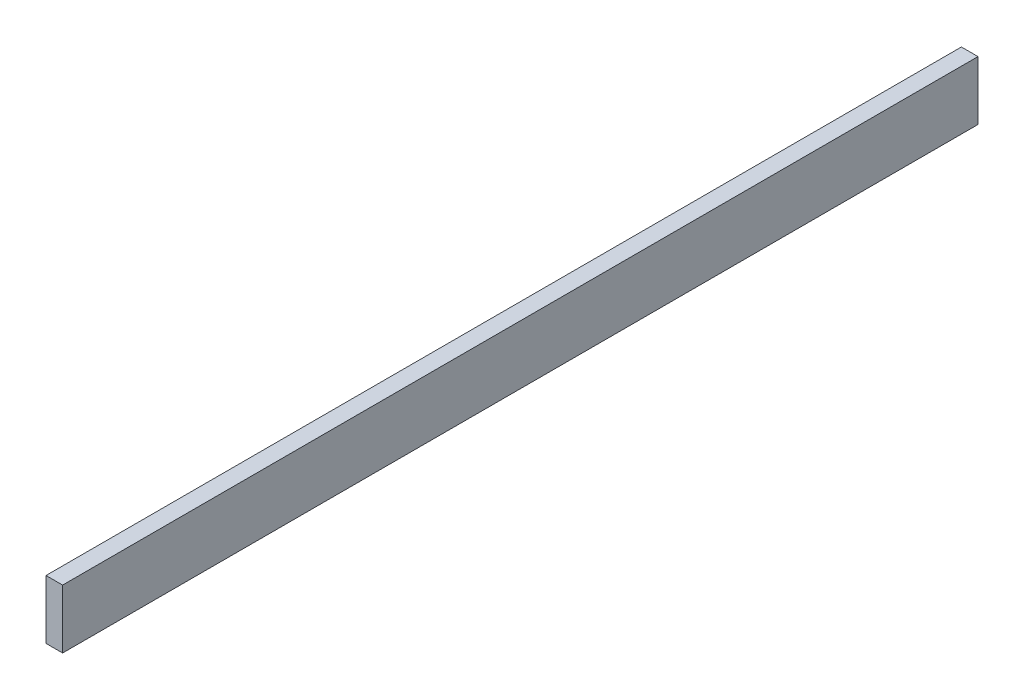
ISO-10303-21;
HEADER;
FILE_DESCRIPTION(('STEP AP214'),'2;1');
FILE_NAME('part.step','',(''),(''),'','','');
FILE_SCHEMA(('AUTOMOTIVE_DESIGN { 1 0 10303 214 1 1 1 1 }'));
ENDSEC;
DATA;
#1=APPLICATION_CONTEXT('core data for automotive mechanical design processes');
#2=APPLICATION_PROTOCOL_DEFINITION('international standard','automotive_design',2000,#1);
#3=PRODUCT_CONTEXT('',#1,'mechanical');
#4=PRODUCT('Part','Part','',(#3));
#5=PRODUCT_RELATED_PRODUCT_CATEGORY('part','',(#4));
#6=PRODUCT_DEFINITION_FORMATION('','',#4);
#7=PRODUCT_DEFINITION_CONTEXT('part definition',#1,'design');
#8=PRODUCT_DEFINITION('design','',#6,#7);
#9=PRODUCT_DEFINITION_SHAPE('','',#8);
#10=(LENGTH_UNIT() NAMED_UNIT(*) SI_UNIT(.MILLI.,.METRE.));
#11=(NAMED_UNIT(*) PLANE_ANGLE_UNIT() SI_UNIT($,.RADIAN.));
#12=(NAMED_UNIT(*) SI_UNIT($,.STERADIAN.) SOLID_ANGLE_UNIT());
#13=UNCERTAINTY_MEASURE_WITH_UNIT(LENGTH_MEASURE(1.E-05),#10,'distance_accuracy_value','');
#14=(GEOMETRIC_REPRESENTATION_CONTEXT(3) GLOBAL_UNCERTAINTY_ASSIGNED_CONTEXT((#13)) GLOBAL_UNIT_ASSIGNED_CONTEXT((#10,
#11,#12)) REPRESENTATION_CONTEXT('',''));
#15=CARTESIAN_POINT('',(0.,0.,0.));
#16=DIRECTION('',(0.,0.,1.));
#17=DIRECTION('',(1.,0.,0.));
#18=AXIS2_PLACEMENT_3D('',#15,#16,#17);
#19=CARTESIAN_POINT('',(1325.3,1527.,-700.));
#20=DIRECTION('',(-1.,0.,0.));
#21=DIRECTION('',(0.,0.,1.));
#22=AXIS2_PLACEMENT_3D('',#19,#20,#21);
#23=PLANE('',#22);
#24=DIRECTION('',(0.,-1.,0.));
#25=VECTOR('',#24,1.);
#26=CARTESIAN_POINT('',(1325.3,1527.,0.));
#27=LINE('',#26,#25);
#28=CARTESIAN_POINT('',(1325.3,1572.,0.));
#29=VERTEX_POINT('',#28);
#30=CARTESIAN_POINT('',(1325.3,1527.,0.));
#31=VERTEX_POINT('',#30);
#32=EDGE_CURVE('E103',#29,#31,#27,.T.);
#33=ORIENTED_EDGE('',*,*,#32,.F.);
#34=DIRECTION('',(0.,0.,1.));
#35=VECTOR('',#34,1.);
#36=CARTESIAN_POINT('',(1325.3,1572.,-700.));
#37=LINE('',#36,#35);
#38=CARTESIAN_POINT('',(1325.3,1572.,-700.));
#39=VERTEX_POINT('',#38);
#40=EDGE_CURVE('E11',#39,#29,#37,.T.);
#41=ORIENTED_EDGE('',*,*,#40,.F.);
#42=DIRECTION('',(0.,-1.,0.));
#43=VECTOR('',#42,1.);
#44=CARTESIAN_POINT('',(1325.3,1527.,-700.));
#45=LINE('',#44,#43);
#46=CARTESIAN_POINT('',(1325.3,1527.,-700.));
#47=VERTEX_POINT('',#46);
#48=EDGE_CURVE('E97',#39,#47,#45,.T.);
#49=ORIENTED_EDGE('',*,*,#48,.T.);
#50=DIRECTION('',(0.,0.,1.));
#51=VECTOR('',#50,1.);
#52=CARTESIAN_POINT('',(1325.3,1527.,-700.));
#53=LINE('',#52,#51);
#54=EDGE_CURVE('E42',#47,#31,#53,.T.);
#55=ORIENTED_EDGE('',*,*,#54,.T.);
#56=EDGE_LOOP('',(#33,#41,#49,#55));
#57=FACE_BOUND('',#56,.T.);
#58=ADVANCED_FACE('F39',(#57),#23,.T.);
#59=CARTESIAN_POINT('',(1325.3,1572.,-700.));
#60=DIRECTION('',(0.,1.,0.));
#61=DIRECTION('',(0.,0.,1.));
#62=AXIS2_PLACEMENT_3D('',#59,#60,#61);
#63=PLANE('',#62);
#64=DIRECTION('',(-1.,0.,0.));
#65=VECTOR('',#64,1.);
#66=CARTESIAN_POINT('',(1325.3,1572.,0.));
#67=LINE('',#66,#65);
#68=CARTESIAN_POINT('',(1338.,1572.,0.));
#69=VERTEX_POINT('',#68);
#70=EDGE_CURVE('E99',#69,#29,#67,.T.);
#71=ORIENTED_EDGE('',*,*,#70,.F.);
#72=DIRECTION('',(0.,0.,1.));
#73=VECTOR('',#72,1.);
#74=CARTESIAN_POINT('',(1338.,1572.,-700.));
#75=LINE('',#74,#73);
#76=CARTESIAN_POINT('',(1338.,1572.,-700.));
#77=VERTEX_POINT('',#76);
#78=EDGE_CURVE('E48',#77,#69,#75,.T.);
#79=ORIENTED_EDGE('',*,*,#78,.F.);
#80=DIRECTION('',(-1.,0.,0.));
#81=VECTOR('',#80,1.);
#82=CARTESIAN_POINT('',(1325.3,1572.,-700.));
#83=LINE('',#82,#81);
#84=EDGE_CURVE('E94',#77,#39,#83,.T.);
#85=ORIENTED_EDGE('',*,*,#84,.T.);
#86=ORIENTED_EDGE('',*,*,#40,.T.);
#87=EDGE_LOOP('',(#71,#79,#85,#86));
#88=FACE_BOUND('',#87,.T.);
#89=ADVANCED_FACE('F113',(#88),#63,.T.);
#90=CARTESIAN_POINT('',(1338.,1527.,-700.));
#91=DIRECTION('',(1.,0.,0.));
#92=DIRECTION('',(0.,0.,-1.));
#93=AXIS2_PLACEMENT_3D('',#90,#91,#92);
#94=PLANE('',#93);
#95=DIRECTION('',(0.,1.,0.));
#96=VECTOR('',#95,1.);
#97=CARTESIAN_POINT('',(1338.,1527.,0.));
#98=LINE('',#97,#96);
#99=CARTESIAN_POINT('',(1338.,1527.,0.));
#100=VERTEX_POINT('',#99);
#101=EDGE_CURVE('E89',#100,#69,#98,.T.);
#102=ORIENTED_EDGE('',*,*,#101,.F.);
#103=DIRECTION('',(0.,0.,1.));
#104=VECTOR('',#103,1.);
#105=CARTESIAN_POINT('',(1338.,1527.,-700.));
#106=LINE('',#105,#104);
#107=CARTESIAN_POINT('',(1338.,1527.,-700.));
#108=VERTEX_POINT('',#107);
#109=EDGE_CURVE('E84',#108,#100,#106,.T.);
#110=ORIENTED_EDGE('',*,*,#109,.F.);
#111=DIRECTION('',(0.,1.,0.));
#112=VECTOR('',#111,1.);
#113=CARTESIAN_POINT('',(1338.,1527.,-700.));
#114=LINE('',#113,#112);
#115=EDGE_CURVE('E87',#108,#77,#114,.T.);
#116=ORIENTED_EDGE('',*,*,#115,.T.);
#117=ORIENTED_EDGE('',*,*,#78,.T.);
#118=EDGE_LOOP('',(#102,#110,#116,#117));
#119=FACE_BOUND('',#118,.T.);
#120=ADVANCED_FACE('F86',(#119),#94,.T.);
#121=CARTESIAN_POINT('',(1325.3,1527.,-700.));
#122=DIRECTION('',(0.,-1.,0.));
#123=DIRECTION('',(0.,0.,-1.));
#124=AXIS2_PLACEMENT_3D('',#121,#122,#123);
#125=PLANE('',#124);
#126=DIRECTION('',(1.,0.,0.));
#127=VECTOR('',#126,1.);
#128=CARTESIAN_POINT('',(1325.3,1527.,0.));
#129=LINE('',#128,#127);
#130=EDGE_CURVE('E106',#31,#100,#129,.T.);
#131=ORIENTED_EDGE('',*,*,#130,.F.);
#132=ORIENTED_EDGE('',*,*,#54,.F.);
#133=DIRECTION('',(1.,0.,0.));
#134=VECTOR('',#133,1.);
#135=CARTESIAN_POINT('',(1325.3,1527.,-700.));
#136=LINE('',#135,#134);
#137=EDGE_CURVE('E93',#47,#108,#136,.T.);
#138=ORIENTED_EDGE('',*,*,#137,.T.);
#139=ORIENTED_EDGE('',*,*,#109,.T.);
#140=EDGE_LOOP('',(#131,#132,#138,#139));
#141=FACE_BOUND('',#140,.T.);
#142=ADVANCED_FACE('F96',(#141),#125,.T.);
#143=CARTESIAN_POINT('',(0.,0.,-700.));
#144=DIRECTION('',(0.,0.,-1.));
#145=DIRECTION('',(-1.,0.,0.));
#146=AXIS2_PLACEMENT_3D('',#143,#144,#145);
#147=PLANE('',#146);
#148=ORIENTED_EDGE('',*,*,#48,.F.);
#149=ORIENTED_EDGE('',*,*,#84,.F.);
#150=ORIENTED_EDGE('',*,*,#115,.F.);
#151=ORIENTED_EDGE('',*,*,#137,.F.);
#152=EDGE_LOOP('',(#148,#149,#150,#151));
#153=FACE_BOUND('',#152,.T.);
#154=ADVANCED_FACE('F92',(#153),#147,.T.);
#155=CARTESIAN_POINT('',(0.,0.,0.));
#156=DIRECTION('',(0.,0.,-1.));
#157=DIRECTION('',(-1.,0.,0.));
#158=AXIS2_PLACEMENT_3D('',#155,#156,#157);
#159=PLANE('',#158);
#160=ORIENTED_EDGE('',*,*,#32,.T.);
#161=ORIENTED_EDGE('',*,*,#130,.T.);
#162=ORIENTED_EDGE('',*,*,#101,.T.);
#163=ORIENTED_EDGE('',*,*,#70,.T.);
#164=EDGE_LOOP('',(#160,#161,#162,#163));
#165=FACE_BOUND('',#164,.T.);
#166=ADVANCED_FACE('F112',(#165),#159,.F.);
#167=CLOSED_SHELL('',(#58,#89,#120,#142,#154,#166));
#168=MANIFOLD_SOLID_BREP('B2',#167);
#169=ADVANCED_BREP_SHAPE_REPRESENTATION('',(#18,#168),#14);
#170=SHAPE_DEFINITION_REPRESENTATION(#9,#169);
ENDSEC;
END-ISO-10303-21;
